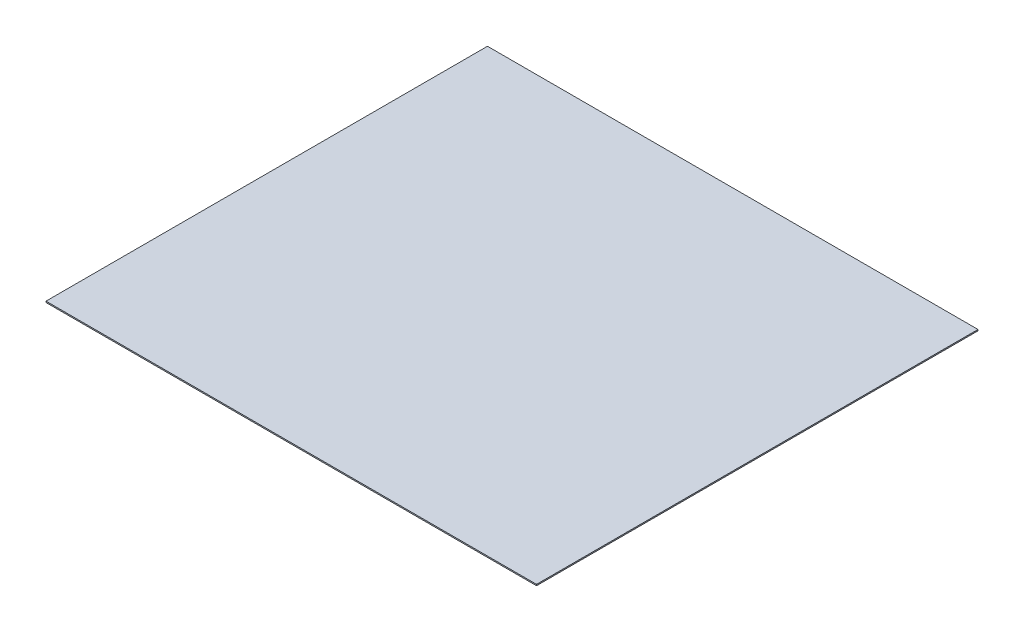
ISO-10303-21;
HEADER;
FILE_DESCRIPTION(('STEP AP214'),'2;1');
FILE_NAME('part.step','',(''),(''),'','','');
FILE_SCHEMA(('AUTOMOTIVE_DESIGN { 1 0 10303 214 1 1 1 1 }'));
ENDSEC;
DATA;
#1=APPLICATION_CONTEXT('core data for automotive mechanical design processes');
#2=APPLICATION_PROTOCOL_DEFINITION('international standard','automotive_design',2000,#1);
#3=PRODUCT_CONTEXT('',#1,'mechanical');
#4=PRODUCT('Part','Part','',(#3));
#5=PRODUCT_RELATED_PRODUCT_CATEGORY('part','',(#4));
#6=PRODUCT_DEFINITION_FORMATION('','',#4);
#7=PRODUCT_DEFINITION_CONTEXT('part definition',#1,'design');
#8=PRODUCT_DEFINITION('design','',#6,#7);
#9=PRODUCT_DEFINITION_SHAPE('','',#8);
#10=(LENGTH_UNIT() NAMED_UNIT(*) SI_UNIT(.MILLI.,.METRE.));
#11=(NAMED_UNIT(*) PLANE_ANGLE_UNIT() SI_UNIT($,.RADIAN.));
#12=(NAMED_UNIT(*) SI_UNIT($,.STERADIAN.) SOLID_ANGLE_UNIT());
#13=UNCERTAINTY_MEASURE_WITH_UNIT(LENGTH_MEASURE(1.E-05),#10,'distance_accuracy_value','');
#14=(GEOMETRIC_REPRESENTATION_CONTEXT(3) GLOBAL_UNCERTAINTY_ASSIGNED_CONTEXT((#13)) GLOBAL_UNIT_ASSIGNED_CONTEXT((#10,
#11,#12)) REPRESENTATION_CONTEXT('',''));
#15=CARTESIAN_POINT('',(0.,0.,0.));
#16=DIRECTION('',(0.,0.,1.));
#17=DIRECTION('',(1.,0.,0.));
#18=AXIS2_PLACEMENT_3D('',#15,#16,#17);
#19=CARTESIAN_POINT('',(-220.,1.,-180.));
#20=DIRECTION('',(1.,0.,0.));
#21=DIRECTION('',(0.,0.,-1.));
#22=AXIS2_PLACEMENT_3D('',#19,#20,#21);
#23=PLANE('',#22);
#24=DIRECTION('',(0.,0.,1.));
#25=VECTOR('',#24,1.);
#26=CARTESIAN_POINT('',(-220.,0.,-180.));
#27=LINE('',#26,#25);
#28=CARTESIAN_POINT('',(-220.,0.,-180.));
#29=VERTEX_POINT('',#28);
#30=CARTESIAN_POINT('',(-220.,0.,180.));
#31=VERTEX_POINT('',#30);
#32=EDGE_CURVE('E95',#29,#31,#27,.T.);
#33=ORIENTED_EDGE('',*,*,#32,.T.);
#34=DIRECTION('',(0.,-1.,0.));
#35=VECTOR('',#34,1.);
#36=CARTESIAN_POINT('',(-220.,1.,180.));
#37=LINE('',#36,#35);
#38=CARTESIAN_POINT('',(-220.,1.,180.));
#39=VERTEX_POINT('',#38);
#40=EDGE_CURVE('E11',#39,#31,#37,.T.);
#41=ORIENTED_EDGE('',*,*,#40,.F.);
#42=DIRECTION('',(0.,0.,1.));
#43=VECTOR('',#42,1.);
#44=CARTESIAN_POINT('',(-220.,1.,-180.));
#45=LINE('',#44,#43);
#46=CARTESIAN_POINT('',(-220.,1.,-180.));
#47=VERTEX_POINT('',#46);
#48=EDGE_CURVE('E83',#47,#39,#45,.T.);
#49=ORIENTED_EDGE('',*,*,#48,.F.);
#50=DIRECTION('',(0.,-1.,0.));
#51=VECTOR('',#50,1.);
#52=CARTESIAN_POINT('',(-220.,1.,-180.));
#53=LINE('',#52,#51);
#54=EDGE_CURVE('E91',#47,#29,#53,.T.);
#55=ORIENTED_EDGE('',*,*,#54,.T.);
#56=EDGE_LOOP('',(#33,#41,#49,#55));
#57=FACE_BOUND('',#56,.T.);
#58=ADVANCED_FACE('F32',(#57),#23,.F.);
#59=CARTESIAN_POINT('',(-220.,1.,180.));
#60=DIRECTION('',(0.,0.,-1.));
#61=DIRECTION('',(-1.,0.,0.));
#62=AXIS2_PLACEMENT_3D('',#59,#60,#61);
#63=PLANE('',#62);
#64=DIRECTION('',(1.,0.,0.));
#65=VECTOR('',#64,1.);
#66=CARTESIAN_POINT('',(-220.,0.,180.));
#67=LINE('',#66,#65);
#68=CARTESIAN_POINT('',(180.,0.,180.));
#69=VERTEX_POINT('',#68);
#70=EDGE_CURVE('E87',#31,#69,#67,.T.);
#71=ORIENTED_EDGE('',*,*,#70,.T.);
#72=DIRECTION('',(0.,-1.,0.));
#73=VECTOR('',#72,1.);
#74=CARTESIAN_POINT('',(180.,1.,180.));
#75=LINE('',#74,#73);
#76=CARTESIAN_POINT('',(180.,1.,180.));
#77=VERTEX_POINT('',#76);
#78=EDGE_CURVE('E40',#77,#69,#75,.T.);
#79=ORIENTED_EDGE('',*,*,#78,.F.);
#80=DIRECTION('',(1.,0.,0.));
#81=VECTOR('',#80,1.);
#82=CARTESIAN_POINT('',(-220.,1.,180.));
#83=LINE('',#82,#81);
#84=EDGE_CURVE('E78',#39,#77,#83,.T.);
#85=ORIENTED_EDGE('',*,*,#84,.F.);
#86=ORIENTED_EDGE('',*,*,#40,.T.);
#87=EDGE_LOOP('',(#71,#79,#85,#86));
#88=FACE_BOUND('',#87,.T.);
#89=ADVANCED_FACE('F86',(#88),#63,.F.);
#90=CARTESIAN_POINT('',(180.,1.,-180.));
#91=DIRECTION('',(-1.,0.,0.));
#92=DIRECTION('',(0.,0.,1.));
#93=AXIS2_PLACEMENT_3D('',#90,#91,#92);
#94=PLANE('',#93);
#95=DIRECTION('',(0.,0.,-1.));
#96=VECTOR('',#95,1.);
#97=CARTESIAN_POINT('',(180.,0.,-180.));
#98=LINE('',#97,#96);
#99=CARTESIAN_POINT('',(180.,0.,-180.));
#100=VERTEX_POINT('',#99);
#101=EDGE_CURVE('E65',#69,#100,#98,.T.);
#102=ORIENTED_EDGE('',*,*,#101,.T.);
#103=DIRECTION('',(0.,-1.,0.));
#104=VECTOR('',#103,1.);
#105=CARTESIAN_POINT('',(180.,1.,-180.));
#106=LINE('',#105,#104);
#107=CARTESIAN_POINT('',(180.,1.,-180.));
#108=VERTEX_POINT('',#107);
#109=EDGE_CURVE('E88',#108,#100,#106,.T.);
#110=ORIENTED_EDGE('',*,*,#109,.F.);
#111=DIRECTION('',(0.,0.,-1.));
#112=VECTOR('',#111,1.);
#113=CARTESIAN_POINT('',(180.,1.,-180.));
#114=LINE('',#113,#112);
#115=EDGE_CURVE('E81',#77,#108,#114,.T.);
#116=ORIENTED_EDGE('',*,*,#115,.F.);
#117=ORIENTED_EDGE('',*,*,#78,.T.);
#118=EDGE_LOOP('',(#102,#110,#116,#117));
#119=FACE_BOUND('',#118,.T.);
#120=ADVANCED_FACE('F89',(#119),#94,.F.);
#121=CARTESIAN_POINT('',(-220.,1.,-180.));
#122=DIRECTION('',(0.,0.,1.));
#123=DIRECTION('',(1.,0.,0.));
#124=AXIS2_PLACEMENT_3D('',#121,#122,#123);
#125=PLANE('',#124);
#126=DIRECTION('',(-1.,0.,0.));
#127=VECTOR('',#126,1.);
#128=CARTESIAN_POINT('',(-220.,0.,-180.));
#129=LINE('',#128,#127);
#130=EDGE_CURVE('E71',#100,#29,#129,.T.);
#131=ORIENTED_EDGE('',*,*,#130,.T.);
#132=ORIENTED_EDGE('',*,*,#54,.F.);
#133=DIRECTION('',(-1.,0.,0.));
#134=VECTOR('',#133,1.);
#135=CARTESIAN_POINT('',(-220.,1.,-180.));
#136=LINE('',#135,#134);
#137=EDGE_CURVE('E48',#108,#47,#136,.T.);
#138=ORIENTED_EDGE('',*,*,#137,.F.);
#139=ORIENTED_EDGE('',*,*,#109,.T.);
#140=EDGE_LOOP('',(#131,#132,#138,#139));
#141=FACE_BOUND('',#140,.T.);
#142=ADVANCED_FACE('F102',(#141),#125,.F.);
#143=CARTESIAN_POINT('',(0.,1.,0.));
#144=DIRECTION('',(0.,1.,0.));
#145=DIRECTION('',(0.,0.,1.));
#146=AXIS2_PLACEMENT_3D('',#143,#144,#145);
#147=PLANE('',#146);
#148=ORIENTED_EDGE('',*,*,#48,.T.);
#149=ORIENTED_EDGE('',*,*,#84,.T.);
#150=ORIENTED_EDGE('',*,*,#115,.T.);
#151=ORIENTED_EDGE('',*,*,#137,.T.);
#152=EDGE_LOOP('',(#148,#149,#150,#151));
#153=FACE_BOUND('',#152,.T.);
#154=ADVANCED_FACE('F79',(#153),#147,.T.);
#155=CARTESIAN_POINT('',(0.,0.,0.));
#156=DIRECTION('',(0.,1.,0.));
#157=DIRECTION('',(0.,0.,1.));
#158=AXIS2_PLACEMENT_3D('',#155,#156,#157);
#159=PLANE('',#158);
#160=ORIENTED_EDGE('',*,*,#32,.F.);
#161=ORIENTED_EDGE('',*,*,#130,.F.);
#162=ORIENTED_EDGE('',*,*,#101,.F.);
#163=ORIENTED_EDGE('',*,*,#70,.F.);
#164=EDGE_LOOP('',(#160,#161,#162,#163));
#165=FACE_BOUND('',#164,.T.);
#166=ADVANCED_FACE('F105',(#165),#159,.F.);
#167=CLOSED_SHELL('',(#58,#89,#120,#142,#154,#166));
#168=MANIFOLD_SOLID_BREP('B2',#167);
#169=ADVANCED_BREP_SHAPE_REPRESENTATION('',(#18,#168),#14);
#170=SHAPE_DEFINITION_REPRESENTATION(#9,#169);
ENDSEC;
END-ISO-10303-21;
